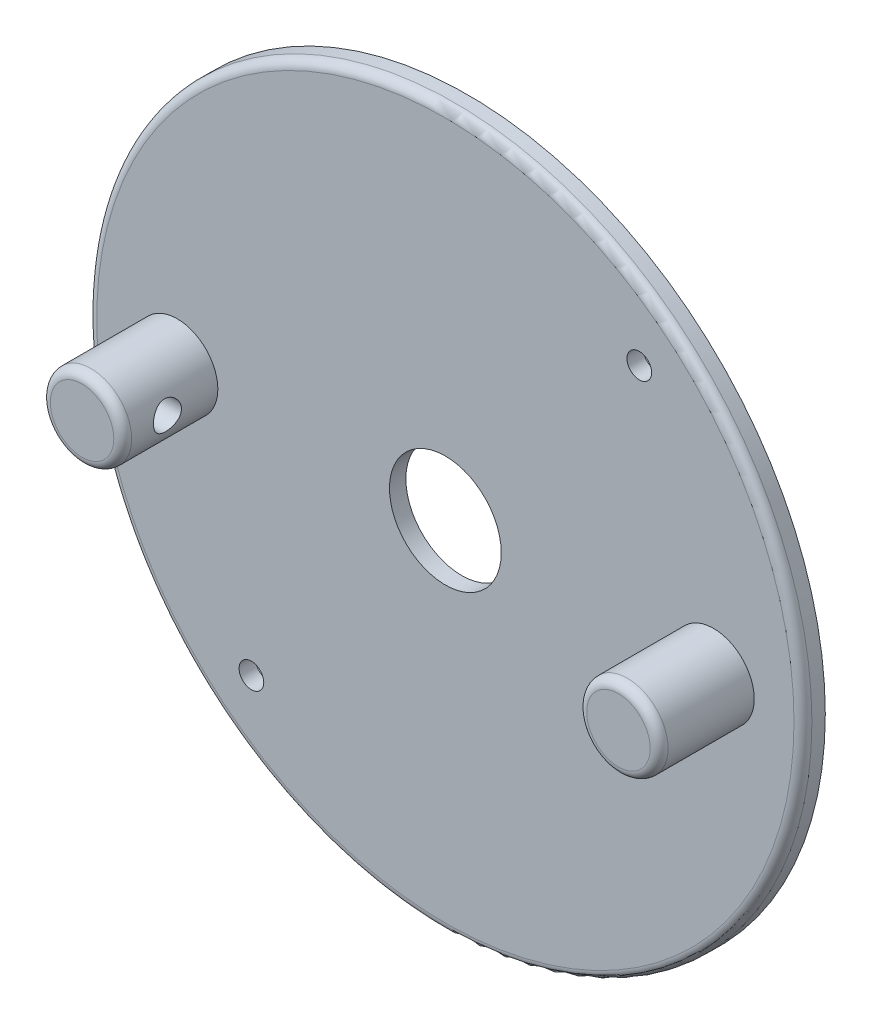
ISO-10303-21;
HEADER;
FILE_DESCRIPTION(('STEP AP214'),'2;1');
FILE_NAME('part.step','',(''),(''),'','','');
FILE_SCHEMA(('AUTOMOTIVE_DESIGN { 1 0 10303 214 1 1 1 1 }'));
ENDSEC;
DATA;
#1=APPLICATION_CONTEXT('core data for automotive mechanical design processes');
#2=APPLICATION_PROTOCOL_DEFINITION('international standard','automotive_design',2000,#1);
#3=PRODUCT_CONTEXT('',#1,'mechanical');
#4=PRODUCT('Part','Part','',(#3));
#5=PRODUCT_RELATED_PRODUCT_CATEGORY('part','',(#4));
#6=PRODUCT_DEFINITION_FORMATION('','',#4);
#7=PRODUCT_DEFINITION_CONTEXT('part definition',#1,'design');
#8=PRODUCT_DEFINITION('design','',#6,#7);
#9=PRODUCT_DEFINITION_SHAPE('','',#8);
#10=(LENGTH_UNIT() NAMED_UNIT(*) SI_UNIT(.MILLI.,.METRE.));
#11=(NAMED_UNIT(*) PLANE_ANGLE_UNIT() SI_UNIT($,.RADIAN.));
#12=(NAMED_UNIT(*) SI_UNIT($,.STERADIAN.) SOLID_ANGLE_UNIT());
#13=UNCERTAINTY_MEASURE_WITH_UNIT(LENGTH_MEASURE(1.E-05),#10,'distance_accuracy_value','');
#14=(GEOMETRIC_REPRESENTATION_CONTEXT(3) GLOBAL_UNCERTAINTY_ASSIGNED_CONTEXT((#13)) GLOBAL_UNIT_ASSIGNED_CONTEXT((#10,
#11,#12)) REPRESENTATION_CONTEXT('',''));
#15=CARTESIAN_POINT('',(0.,0.,0.));
#16=DIRECTION('',(0.,0.,1.));
#17=DIRECTION('',(1.,0.,0.));
#18=AXIS2_PLACEMENT_3D('',#15,#16,#17);
#19=CARTESIAN_POINT('',(0.,0.,3.175));
#20=DIRECTION('',(0.,0.,-1.));
#21=DIRECTION('',(-1.,0.,0.));
#22=AXIS2_PLACEMENT_3D('',#19,#20,#21);
#23=CYLINDRICAL_SURFACE('',#22,50.8);
#24=CARTESIAN_POINT('',(0.,0.,1.905));
#25=DIRECTION('',(0.,0.,1.));
#26=DIRECTION('',(1.,0.,0.));
#27=AXIS2_PLACEMENT_3D('',#24,#25,#26);
#28=CIRCLE('',#27,50.8);
#29=CARTESIAN_POINT('',(50.8,0.,1.905));
#30=VERTEX_POINT('',#29);
#31=EDGE_CURVE('E11',#30,#30,#28,.F.);
#32=ORIENTED_EDGE('',*,*,#31,.T.);
#33=EDGE_LOOP('',(#32));
#34=FACE_BOUND('',#33,.T.);
#35=CARTESIAN_POINT('',(0.,0.,0.));
#36=DIRECTION('',(0.,0.,1.));
#37=DIRECTION('',(1.,0.,0.));
#38=AXIS2_PLACEMENT_3D('',#35,#36,#37);
#39=CIRCLE('',#38,50.8);
#40=CARTESIAN_POINT('',(50.8,0.,0.));
#41=VERTEX_POINT('',#40);
#42=EDGE_CURVE('E96',#41,#41,#39,.T.);
#43=ORIENTED_EDGE('',*,*,#42,.T.);
#44=EDGE_LOOP('',(#43));
#45=FACE_BOUND('',#44,.T.);
#46=ADVANCED_FACE('F36',(#34,#45),#23,.T.);
#47=CARTESIAN_POINT('',(0.,0.,3.175));
#48=DIRECTION('',(0.,0.,1.));
#49=DIRECTION('',(1.,0.,0.));
#50=AXIS2_PLACEMENT_3D('',#47,#48,#49);
#51=PLANE('',#50);
#52=CARTESIAN_POINT('',(0.,0.,3.175));
#53=DIRECTION('',(0.,0.,1.));
#54=DIRECTION('',(1.,0.,0.));
#55=AXIS2_PLACEMENT_3D('',#52,#53,#54);
#56=CIRCLE('',#55,49.53);
#57=CARTESIAN_POINT('',(49.53,0.,3.175));
#58=VERTEX_POINT('',#57);
#59=EDGE_CURVE('E45',#58,#58,#56,.T.);
#60=ORIENTED_EDGE('',*,*,#59,.T.);
#61=EDGE_LOOP('',(#60));
#62=FACE_BOUND('',#61,.T.);
#63=CARTESIAN_POINT('',(38.1,0.,3.175));
#64=DIRECTION('',(0.,0.,1.));
#65=DIRECTION('',(1.,0.,0.));
#66=AXIS2_PLACEMENT_3D('',#63,#64,#65);
#67=CIRCLE('',#66,5.7785);
#68=CARTESIAN_POINT('',(43.8785,0.,3.175));
#69=VERTEX_POINT('',#68);
#70=EDGE_CURVE('E67',#69,#69,#67,.T.);
#71=ORIENTED_EDGE('',*,*,#70,.F.);
#72=EDGE_LOOP('',(#71));
#73=FACE_BOUND('',#72,.T.);
#74=CARTESIAN_POINT('',(-38.1,0.,3.175));
#75=DIRECTION('',(0.,0.,1.));
#76=DIRECTION('',(1.,0.,0.));
#77=AXIS2_PLACEMENT_3D('',#74,#75,#76);
#78=CIRCLE('',#77,5.7785);
#79=CARTESIAN_POINT('',(-32.3215,0.,3.175));
#80=VERTEX_POINT('',#79);
#81=EDGE_CURVE('E73',#80,#80,#78,.T.);
#82=ORIENTED_EDGE('',*,*,#81,.F.);
#83=EDGE_LOOP('',(#82));
#84=FACE_BOUND('',#83,.T.);
#85=CARTESIAN_POINT('',(27.5514839201892,32.8345799431872,3.175));
#86=DIRECTION('',(0.,0.,1.));
#87=DIRECTION('',(1.,0.,0.));
#88=AXIS2_PLACEMENT_3D('',#85,#86,#87);
#89=CIRCLE('',#88,1.7526);
#90=CARTESIAN_POINT('',(29.3040839201892,32.8345799431872,3.175));
#91=VERTEX_POINT('',#90);
#92=EDGE_CURVE('E78',#91,#91,#89,.T.);
#93=ORIENTED_EDGE('',*,*,#92,.F.);
#94=EDGE_LOOP('',(#93));
#95=FACE_BOUND('',#94,.T.);
#96=CARTESIAN_POINT('',(-27.5514839201892,-32.8345799431873,3.175));
#97=DIRECTION('',(0.,0.,1.));
#98=DIRECTION('',(1.,0.,0.));
#99=AXIS2_PLACEMENT_3D('',#96,#97,#98);
#100=CIRCLE('',#99,1.7526);
#101=CARTESIAN_POINT('',(-25.7988839201892,-32.8345799431873,3.175));
#102=VERTEX_POINT('',#101);
#103=EDGE_CURVE('E77',#102,#102,#100,.T.);
#104=ORIENTED_EDGE('',*,*,#103,.F.);
#105=EDGE_LOOP('',(#104));
#106=FACE_BOUND('',#105,.T.);
#107=CARTESIAN_POINT('',(0.,0.,3.175));
#108=DIRECTION('',(0.,0.,1.));
#109=DIRECTION('',(1.,0.,0.));
#110=AXIS2_PLACEMENT_3D('',#107,#108,#109);
#111=CIRCLE('',#110,7.9375);
#112=CARTESIAN_POINT('',(7.9375,0.,3.175));
#113=VERTEX_POINT('',#112);
#114=EDGE_CURVE('E86',#113,#113,#111,.T.);
#115=ORIENTED_EDGE('',*,*,#114,.F.);
#116=EDGE_LOOP('',(#115));
#117=FACE_BOUND('',#116,.T.);
#118=ADVANCED_FACE('F158',(#62,#73,#84,#95,#106,#117),#51,.T.);
#119=CARTESIAN_POINT('',(0.,0.,0.));
#120=DIRECTION('',(0.,0.,1.));
#121=DIRECTION('',(1.,0.,0.));
#122=AXIS2_PLACEMENT_3D('',#119,#120,#121);
#123=PLANE('',#122);
#124=CARTESIAN_POINT('',(0.,0.,0.));
#125=DIRECTION('',(0.,0.,-1.));
#126=DIRECTION('',(-1.,0.,0.));
#127=AXIS2_PLACEMENT_3D('',#124,#125,#126);
#128=CIRCLE('',#127,48.26);
#129=CARTESIAN_POINT('',(-48.26,0.,0.));
#130=VERTEX_POINT('',#129);
#131=EDGE_CURVE('E97',#130,#130,#128,.T.);
#132=ORIENTED_EDGE('',*,*,#131,.F.);
#133=EDGE_LOOP('',(#132));
#134=FACE_BOUND('',#133,.T.);
#135=ORIENTED_EDGE('',*,*,#42,.F.);
#136=EDGE_LOOP('',(#135));
#137=FACE_BOUND('',#136,.T.);
#138=ADVANCED_FACE('F164',(#134,#137),#123,.F.);
#139=CARTESIAN_POINT('',(0.,0.,0.84582));
#140=DIRECTION('',(0.,0.,-1.));
#141=DIRECTION('',(-1.,0.,0.));
#142=AXIS2_PLACEMENT_3D('',#139,#140,#141);
#143=CYLINDRICAL_SURFACE('',#142,48.26);
#144=CARTESIAN_POINT('',(0.,0.,0.84582));
#145=DIRECTION('',(0.,0.,-1.));
#146=DIRECTION('',(-1.,0.,0.));
#147=AXIS2_PLACEMENT_3D('',#144,#145,#146);
#148=CIRCLE('',#147,48.26);
#149=CARTESIAN_POINT('',(-48.26,0.,0.84582));
#150=VERTEX_POINT('',#149);
#151=EDGE_CURVE('E92',#150,#150,#148,.T.);
#152=ORIENTED_EDGE('',*,*,#151,.F.);
#153=EDGE_LOOP('',(#152));
#154=FACE_BOUND('',#153,.T.);
#155=ORIENTED_EDGE('',*,*,#131,.T.);
#156=EDGE_LOOP('',(#155));
#157=FACE_BOUND('',#156,.T.);
#158=ADVANCED_FACE('F223',(#154,#157),#143,.F.);
#159=CARTESIAN_POINT('',(0.,0.,0.84582));
#160=DIRECTION('',(0.,0.,-1.));
#161=DIRECTION('',(-1.,0.,0.));
#162=AXIS2_PLACEMENT_3D('',#159,#160,#161);
#163=PLANE('',#162);
#164=CARTESIAN_POINT('',(27.5514839201892,32.8345799431872,0.84582));
#165=DIRECTION('',(0.,0.,-1.));
#166=DIRECTION('',(-1.,0.,0.));
#167=AXIS2_PLACEMENT_3D('',#164,#165,#166);
#168=CIRCLE('',#167,1.7526);
#169=CARTESIAN_POINT('',(25.7988839201892,32.8345799431872,0.84582));
#170=VERTEX_POINT('',#169);
#171=EDGE_CURVE('E91',#170,#170,#168,.T.);
#172=ORIENTED_EDGE('',*,*,#171,.F.);
#173=EDGE_LOOP('',(#172));
#174=FACE_BOUND('',#173,.T.);
#175=CARTESIAN_POINT('',(-27.5514839201892,-32.8345799431873,0.84582));
#176=DIRECTION('',(0.,0.,-1.));
#177=DIRECTION('',(-1.,0.,0.));
#178=AXIS2_PLACEMENT_3D('',#175,#176,#177);
#179=CIRCLE('',#178,1.7526);
#180=CARTESIAN_POINT('',(-29.3040839201892,-32.8345799431873,0.84582));
#181=VERTEX_POINT('',#180);
#182=EDGE_CURVE('E82',#181,#181,#179,.T.);
#183=ORIENTED_EDGE('',*,*,#182,.F.);
#184=EDGE_LOOP('',(#183));
#185=FACE_BOUND('',#184,.T.);
#186=CARTESIAN_POINT('',(0.,0.,0.845820000000001));
#187=DIRECTION('',(0.,0.,-1.));
#188=DIRECTION('',(-1.,0.,0.));
#189=AXIS2_PLACEMENT_3D('',#186,#187,#188);
#190=CIRCLE('',#189,7.9375);
#191=CARTESIAN_POINT('',(-7.9375,0.,0.845820000000001));
#192=VERTEX_POINT('',#191);
#193=EDGE_CURVE('E90',#192,#192,#190,.T.);
#194=ORIENTED_EDGE('',*,*,#193,.F.);
#195=EDGE_LOOP('',(#194));
#196=FACE_BOUND('',#195,.T.);
#197=ORIENTED_EDGE('',*,*,#151,.T.);
#198=EDGE_LOOP('',(#197));
#199=FACE_BOUND('',#198,.T.);
#200=ADVANCED_FACE('F214',(#174,#185,#196,#199),#163,.T.);
#201=CARTESIAN_POINT('',(0.,0.,-17.9578));
#202=DIRECTION('',(0.,0.,1.));
#203=DIRECTION('',(1.,0.,0.));
#204=AXIS2_PLACEMENT_3D('',#201,#202,#203);
#205=CYLINDRICAL_SURFACE('',#204,7.9375);
#206=ORIENTED_EDGE('',*,*,#193,.T.);
#207=EDGE_LOOP('',(#206));
#208=FACE_BOUND('',#207,.T.);
#209=ORIENTED_EDGE('',*,*,#114,.T.);
#210=EDGE_LOOP('',(#209));
#211=FACE_BOUND('',#210,.T.);
#212=ADVANCED_FACE('F211',(#208,#211),#205,.F.);
#213=CARTESIAN_POINT('',(-27.5514839201892,-32.8345799431873,0.));
#214=DIRECTION('',(0.,0.,1.));
#215=DIRECTION('',(1.,0.,0.));
#216=AXIS2_PLACEMENT_3D('',#213,#214,#215);
#217=CYLINDRICAL_SURFACE('',#216,1.7526);
#218=ORIENTED_EDGE('',*,*,#182,.T.);
#219=EDGE_LOOP('',(#218));
#220=FACE_BOUND('',#219,.T.);
#221=ORIENTED_EDGE('',*,*,#103,.T.);
#222=EDGE_LOOP('',(#221));
#223=FACE_BOUND('',#222,.T.);
#224=ADVANCED_FACE('F213',(#220,#223),#217,.F.);
#225=CARTESIAN_POINT('',(27.5514839201892,32.8345799431872,0.));
#226=DIRECTION('',(0.,0.,1.));
#227=DIRECTION('',(1.,0.,0.));
#228=AXIS2_PLACEMENT_3D('',#225,#226,#227);
#229=CYLINDRICAL_SURFACE('',#228,1.7526);
#230=ORIENTED_EDGE('',*,*,#171,.T.);
#231=EDGE_LOOP('',(#230));
#232=FACE_BOUND('',#231,.T.);
#233=ORIENTED_EDGE('',*,*,#92,.T.);
#234=EDGE_LOOP('',(#233));
#235=FACE_BOUND('',#234,.T.);
#236=ADVANCED_FACE('F154',(#232,#235),#229,.F.);
#237=CARTESIAN_POINT('',(-38.1,0.,16.6878));
#238=DIRECTION('',(0.,0.,-1.));
#239=DIRECTION('',(-1.,0.,0.));
#240=AXIS2_PLACEMENT_3D('',#237,#238,#239);
#241=CYLINDRICAL_SURFACE('',#240,5.7785);
#242=CARTESIAN_POINT('',(-38.1,0.,15.4178));
#243=DIRECTION('',(0.,0.,1.));
#244=DIRECTION('',(1.,0.,0.));
#245=AXIS2_PLACEMENT_3D('',#242,#243,#244);
#246=CIRCLE('',#245,5.7785);
#247=CARTESIAN_POINT('',(-32.3215,0.,15.4178));
#248=VERTEX_POINT('',#247);
#249=EDGE_CURVE('E182',#248,#248,#246,.F.);
#250=ORIENTED_EDGE('',*,*,#249,.T.);
#251=EDGE_LOOP('',(#250));
#252=FACE_BOUND('',#251,.T.);
#253=CARTESIAN_POINT('',(-32.7469233681033,2.17615091917849,10.3295579636098));
#254=CARTESIAN_POINT('',(-32.7469244038182,2.17615210662921,10.2216840506112));
#255=CARTESIAN_POINT('',(-32.7433600864788,2.16744619654072,10.1138185890226));
#256=CARTESIAN_POINT('',(-32.7295397310188,2.13296897794421,9.90129661266825));
#257=CARTESIAN_POINT('',(-32.7192829236911,2.10719570777938,9.79664046821612));
#258=CARTESIAN_POINT('',(-32.6932929184909,2.03957762805224,9.59365298222572));
#259=CARTESIAN_POINT('',(-32.6775709978546,1.99776589553619,9.49530910661279));
#260=CARTESIAN_POINT('',(-32.6423144150311,1.89932989097696,9.30708749807465));
#261=CARTESIAN_POINT('',(-32.6227788336143,1.84270204659537,9.2172118140477));
#262=CARTESIAN_POINT('',(-32.5810182938103,1.71366926240623,9.04474287740923));
#263=CARTESIAN_POINT('',(-32.5587196593025,1.64074951534733,8.96255251735055));
#264=CARTESIAN_POINT('',(-32.5142296735561,1.48222862228021,8.81141552451749));
#265=CARTESIAN_POINT('',(-32.4920383414008,1.39662530043826,8.74247116872999));
#266=CARTESIAN_POINT('',(-32.449254764122,1.21216254702683,8.61792940322431));
#267=CARTESIAN_POINT('',(-32.4287243663925,1.11300002730416,8.56275779126923));
#268=CARTESIAN_POINT('',(-32.3919953238223,0.905967195366005,8.47015224951553));
#269=CARTESIAN_POINT('',(-32.3757954356654,0.798099394095146,8.43271322619275));
#270=CARTESIAN_POINT('',(-32.3497699121055,0.580891297832432,8.37801262580805));
#271=CARTESIAN_POINT('',(-32.339731895439,0.471750810865131,8.36006006969986));
#272=CARTESIAN_POINT('',(-32.3259290934117,0.251625013237367,8.34264102578906));
#273=CARTESIAN_POINT('',(-32.3221625943803,0.140640214902905,8.34316948724335));
#274=CARTESIAN_POINT('',(-32.3210223026354,-0.075116043300754,8.36226748079604));
#275=CARTESIAN_POINT('',(-32.3233891239719,-0.179953928332531,8.38008568644464));
#276=CARTESIAN_POINT('',(-32.333439423202,-0.385237908721068,8.43200997672716));
#277=CARTESIAN_POINT('',(-32.3411232666378,-0.485683701619081,8.46611718117086));
#278=CARTESIAN_POINT('',(-32.3609065571063,-0.680906550101159,8.55006844588344));
#279=CARTESIAN_POINT('',(-32.3730643745771,-0.775588452329316,8.60011930158231));
#280=CARTESIAN_POINT('',(-32.4003231415406,-0.955531460105961,8.71436405674724));
#281=CARTESIAN_POINT('',(-32.4154249434587,-1.04078982585557,8.7785620531964));
#282=CARTESIAN_POINT('',(-32.4476629031354,-1.20391253618106,8.92302736337027));
#283=CARTESIAN_POINT('',(-32.4648629061314,-1.28119759186322,9.00393548550368));
#284=CARTESIAN_POINT('',(-32.4985494030693,-1.42127277276157,9.17761266486548));
#285=CARTESIAN_POINT('',(-32.5150357721416,-1.48406036952183,9.27038378670478));
#286=CARTESIAN_POINT('',(-32.5454547455362,-1.59418243006221,9.46709819632805));
#287=CARTESIAN_POINT('',(-32.5593424317085,-1.6412544916336,9.57119605609472));
#288=CARTESIAN_POINT('',(-32.582286543143,-1.7168222276835,9.7864229435298));
#289=CARTESIAN_POINT('',(-32.5913451428925,-1.74532626443581,9.89754878131379));
#290=CARTESIAN_POINT('',(-32.6029995722092,-1.78168399541011,10.1180186573734));
#291=CARTESIAN_POINT('',(-32.6058821691615,-1.79045498694171,10.2271962519669));
#292=CARTESIAN_POINT('',(-32.6056348446807,-1.78969733689818,10.4454685891209));
#293=CARTESIAN_POINT('',(-32.6025061030731,-1.78017228622616,10.5545633437363));
#294=CARTESIAN_POINT('',(-32.5909072790607,-1.74393066589738,10.7653326569925));
#295=CARTESIAN_POINT('',(-32.5826404227019,-1.7178674393054,10.8671322523003));
#296=CARTESIAN_POINT('',(-32.5619995627249,-1.65010880149831,11.0649394485793));
#297=CARTESIAN_POINT('',(-32.5496248033978,-1.60841051380243,11.1609459799885));
#298=CARTESIAN_POINT('',(-32.5217736650094,-1.50903701486612,11.3479728132912));
#299=CARTESIAN_POINT('',(-32.5062080393339,-1.45087783644519,11.4387221844492));
#300=CARTESIAN_POINT('',(-32.4740822146348,-1.32082961754574,11.6095991420996));
#301=CARTESIAN_POINT('',(-32.457521706419,-1.24893629344195,11.689723401418));
#302=CARTESIAN_POINT('',(-32.4244499842203,-1.08911839364808,11.8413496668015));
#303=CARTESIAN_POINT('',(-32.4079853434608,-1.00055833787977,11.91219404103));
#304=CARTESIAN_POINT('',(-32.3781032327456,-0.812415741125375,12.0381748955506));
#305=CARTESIAN_POINT('',(-32.3646856757522,-0.712833515100821,12.0933118245263));
#306=CARTESIAN_POINT('',(-32.3427584774062,-0.505940319246854,12.1858305783452));
#307=CARTESIAN_POINT('',(-32.334219425056,-0.39868014739064,12.2233185567859));
#308=CARTESIAN_POINT('',(-32.3232310989446,-0.179074656244305,12.2796182029207));
#309=CARTESIAN_POINT('',(-32.3207794756773,-0.0667313159076797,12.2984370744649));
#310=CARTESIAN_POINT('',(-32.3225474275344,0.153832064458494,12.3161850647125));
#311=CARTESIAN_POINT('',(-32.3264416869465,0.261979739308479,12.3160556952414));
#312=CARTESIAN_POINT('',(-32.3401718175418,0.476427293319663,12.2982564342571));
#313=CARTESIAN_POINT('',(-32.3500071558742,0.582727337313912,12.280588115707));
#314=CARTESIAN_POINT('',(-32.3746398763357,0.788595462441957,12.2288475662659));
#315=CARTESIAN_POINT('',(-32.3893462432032,0.888249455671077,12.1950715591305));
#316=CARTESIAN_POINT('',(-32.4225540084652,1.08036252418362,12.112352898834));
#317=CARTESIAN_POINT('',(-32.4410561056684,1.17282027028045,12.0634074520719));
#318=CARTESIAN_POINT('',(-32.481069289294,1.35181945582808,11.9495858917428));
#319=CARTESIAN_POINT('',(-32.5026685038493,1.43799847618216,11.8841712445694));
#320=CARTESIAN_POINT('',(-32.5463504678926,1.59842559102715,11.7401679543348));
#321=CARTESIAN_POINT('',(-32.5684333742899,1.6726697467266,11.6615749795214));
#322=CARTESIAN_POINT('',(-32.6119168676511,1.81037171945293,11.4894801322577));
#323=CARTESIAN_POINT('',(-32.6332491937593,1.87324119289425,11.3954886084865));
#324=CARTESIAN_POINT('',(-32.6718713007698,1.98238450983111,11.1975533615758));
#325=CARTESIAN_POINT('',(-32.6891618237677,2.02866140064408,11.0936114703224));
#326=CARTESIAN_POINT('',(-32.7172919005009,2.10215064409317,10.8812789741633));
#327=CARTESIAN_POINT('',(-32.7282808686548,2.12980752924508,10.773062736966));
#328=CARTESIAN_POINT('',(-32.7430946156112,2.16680334329147,10.5530796599815));
#329=CARTESIAN_POINT('',(-32.7469222951128,2.17614968899122,10.4413142764496));
#330=CARTESIAN_POINT('',(-32.7469233681033,2.17615091917849,10.3295579636098));
#331=B_SPLINE_CURVE_WITH_KNOTS('',3,(#253,#254,#255,#256,#257,#258,#259,#260,#261,#262,#263,
#264,#265,#266,#267,#268,#269,#270,#271,#272,#273,#274,#275,#276,#277,#278,#279,#280,#281,#282,
#283,#284,#285,#286,#287,#288,#289,#290,#291,#292,#293,#294,#295,#296,#297,#298,#299,#300,#301,
#302,#303,#304,#305,#306,#307,#308,#309,#310,#311,#312,#313,#314,#315,#316,#317,#318,#319,#320,
#321,#322,#323,#324,#325,#326,#327,#328,#329,#330),.UNSPECIFIED.,.T.,.F.,(4,2,2,2,2,2,2,2,2,2,2,
2,2,2,2,2,2,2,2,2,2,2,2,2,2,2,2,2,2,2,2,2,2,2,2,2,2,2,4),(0.,0.32320734928644,0.646451853232788,
0.969033264789225,1.2916925262999,1.62652993402205,1.96142484886399,2.30565848151978,
2.64979317615295,2.98128049345205,3.31267721811007,3.63028960958184,3.94792383890102,
4.26985822093876,4.59188595732531,4.92994302115653,5.26805899999,5.61156698762833,
5.95492016626384,6.28195032292876,6.60891630103486,6.92370750195644,7.2385566454391,
7.56384674018581,7.88923845775132,8.23140859475281,8.57356895667228,8.91364416121894,
9.25358808981065,9.57664670149411,9.89967634260453,10.2169819249327,10.5343459769529,
10.8638699353837,11.1935024223396,11.5370636269615,11.8805617023539,12.2155370492695,
12.550376684126),.UNSPECIFIED.);
#332=CARTESIAN_POINT('',(-32.7469233681033,2.17615091917849,10.3295579636098));
#333=VERTEX_POINT('',#332);
#334=EDGE_CURVE('E104',#333,#333,#331,.T.);
#335=ORIENTED_EDGE('',*,*,#334,.T.);
#336=EDGE_LOOP('',(#335));
#337=FACE_BOUND('',#336,.T.);
#338=ORIENTED_EDGE('',*,*,#81,.T.);
#339=EDGE_LOOP('',(#338));
#340=FACE_BOUND('',#339,.T.);
#341=ADVANCED_FACE('F129',(#252,#337,#340),#241,.T.);
#342=CARTESIAN_POINT('',(-38.1,0.,16.6878));
#343=DIRECTION('',(0.,0.,1.));
#344=DIRECTION('',(1.,0.,0.));
#345=AXIS2_PLACEMENT_3D('',#342,#343,#344);
#346=PLANE('',#345);
#347=CARTESIAN_POINT('',(-38.1,0.,16.6878));
#348=DIRECTION('',(0.,0.,1.));
#349=DIRECTION('',(1.,0.,0.));
#350=AXIS2_PLACEMENT_3D('',#347,#348,#349);
#351=CIRCLE('',#350,4.5085);
#352=CARTESIAN_POINT('',(-33.5915,0.,16.6878));
#353=VERTEX_POINT('',#352);
#354=EDGE_CURVE('E184',#353,#353,#351,.T.);
#355=ORIENTED_EDGE('',*,*,#354,.T.);
#356=EDGE_LOOP('',(#355));
#357=FACE_BOUND('',#356,.T.);
#358=ADVANCED_FACE('F147',(#357),#346,.T.);
#359=CARTESIAN_POINT('',(38.1,0.,16.6878));
#360=DIRECTION('',(0.,0.,-1.));
#361=DIRECTION('',(-1.,0.,0.));
#362=AXIS2_PLACEMENT_3D('',#359,#360,#361);
#363=CYLINDRICAL_SURFACE('',#362,5.7785);
#364=CARTESIAN_POINT('',(38.1,0.,15.4178));
#365=DIRECTION('',(0.,0.,1.));
#366=DIRECTION('',(1.,0.,0.));
#367=AXIS2_PLACEMENT_3D('',#364,#365,#366);
#368=CIRCLE('',#367,5.7785);
#369=CARTESIAN_POINT('',(43.8785,0.,15.4178));
#370=VERTEX_POINT('',#369);
#371=EDGE_CURVE('E186',#370,#370,#368,.F.);
#372=ORIENTED_EDGE('',*,*,#371,.T.);
#373=EDGE_LOOP('',(#372));
#374=FACE_BOUND('',#373,.T.);
#375=CARTESIAN_POINT('',(32.3215,0.,12.3032604134634));
#376=CARTESIAN_POINT('',(32.3214998312963,-0.108976033447118,12.291919678465));
#377=CARTESIAN_POINT('',(32.3246108716342,-0.217009715581201,12.271546399676));
#378=CARTESIAN_POINT('',(32.336403151383,-0.428010929301236,12.213518096674));
#379=CARTESIAN_POINT('',(32.3450857295451,-0.530977236874243,12.1758589195562));
#380=CARTESIAN_POINT('',(32.3667838992617,-0.728828132730631,12.0846485916719));
#381=CARTESIAN_POINT('',(32.3797905782373,-0.823728844273163,12.031130153519));
#382=CARTESIAN_POINT('',(32.4085521451682,-1.00338013064217,11.9097303839011));
#383=CARTESIAN_POINT('',(32.4243075526666,-1.08812878148929,11.8418463366442));
#384=CARTESIAN_POINT('',(32.4573239310877,-1.24827694587045,11.6907833040974));
#385=CARTESIAN_POINT('',(32.4746184359291,-1.32324004151058,11.6071484570825));
#386=CARTESIAN_POINT('',(32.5080792116569,-1.45819428937845,11.4283390783135));
#387=CARTESIAN_POINT('',(32.5242453743517,-1.51818400729505,11.3331634423549));
#388=CARTESIAN_POINT('',(32.5535143078838,-1.62188285027728,11.1326350577527));
#389=CARTESIAN_POINT('',(32.5665853354569,-1.66542578922575,11.027191297812));
#390=CARTESIAN_POINT('',(32.5876053856888,-1.73374269108258,10.8099147922498));
#391=CARTESIAN_POINT('',(32.5955567976689,-1.75852541032331,10.6980850535291));
#392=CARTESIAN_POINT('',(32.6049041118912,-1.78751314640834,10.4773304021123));
#393=CARTESIAN_POINT('',(32.6066132546938,-1.79270188167646,10.3685476080208));
#394=CARTESIAN_POINT('',(32.6041101197379,-1.78501362497783,10.1517029070994));
#395=CARTESIAN_POINT('',(32.5998987035499,-1.77213926158631,10.0436408976786));
#396=CARTESIAN_POINT('',(32.5863642215692,-1.72955262294069,9.83480946553108));
#397=CARTESIAN_POINT('',(32.577205960412,-1.70038223275686,9.73391758668027));
#398=CARTESIAN_POINT('',(32.555037552317,-1.62663074362286,9.53839131307035));
#399=CARTESIAN_POINT('',(32.5420266214254,-1.58204650790409,9.44375819666351));
#400=CARTESIAN_POINT('',(32.5131195374552,-1.47679074670646,9.25942117675087));
#401=CARTESIAN_POINT('',(32.4971313188435,-1.41556413102507,9.17004907238764));
#402=CARTESIAN_POINT('',(32.4645152873005,-1.27955404644839,9.00241035353248));
#403=CARTESIAN_POINT('',(32.4478872790591,-1.20476641146522,8.92414716502556));
#404=CARTESIAN_POINT('',(32.4151134844624,-1.03949559711518,8.77705142564019));
#405=CARTESIAN_POINT('',(32.3990302117293,-0.948427052186095,8.7088604578712));
#406=CARTESIAN_POINT('',(32.3702985918548,-0.755687088017073,8.58862648978202));
#407=CARTESIAN_POINT('',(32.3576499534385,-0.654016568892613,8.53658212009262));
#408=CARTESIAN_POINT('',(32.3376469174836,-0.444189688777832,8.45091332417855));
#409=CARTESIAN_POINT('',(32.3302275737331,-0.336131639855298,8.41706422036365));
#410=CARTESIAN_POINT('',(32.3216051565118,-0.115622416163849,8.36809225458675));
#411=CARTESIAN_POINT('',(32.3203997353531,-0.00317291671421596,8.35296232195937));
#412=CARTESIAN_POINT('',(32.3245752559448,0.216893606593657,8.34231218339461));
#413=CARTESIAN_POINT('',(32.3296311066511,0.324472330015977,8.34585271288456));
#414=CARTESIAN_POINT('',(32.3455361414057,0.53719990481705,8.37024584932723));
#415=CARTESIAN_POINT('',(32.3563850006792,0.642348892069951,8.3910974857995));
#416=CARTESIAN_POINT('',(32.382858812512,0.84604549598122,8.4489900381242));
#417=CARTESIAN_POINT('',(32.3984249615222,0.944657129471367,8.48583391794053));
#418=CARTESIAN_POINT('',(32.4330887642928,1.13422931270231,8.57448670591535));
#419=CARTESIAN_POINT('',(32.4521871442579,1.22518828349843,8.62629869265651));
#420=CARTESIAN_POINT('',(32.4931598543041,1.40103504374378,8.74592090892394));
#421=CARTESIAN_POINT('',(32.5151168549102,1.48551006961922,8.81430938909615));
#422=CARTESIAN_POINT('',(32.5591237777584,1.64206527053099,8.96404875424426));
#423=CARTESIAN_POINT('',(32.5811737270341,1.7141415419187,9.0454037061354));
#424=CARTESIAN_POINT('',(32.6240741336502,1.84671258057127,9.2225418036061));
#425=CARTESIAN_POINT('',(32.644845441437,1.90665293688178,9.31876064954621));
#426=CARTESIAN_POINT('',(32.6819097581617,2.00956928731697,9.52067806936046));
#427=CARTESIAN_POINT('',(32.6982037675781,2.05254907231827,9.62637451839579));
#428=CARTESIAN_POINT('',(32.7240130421309,2.11921778526401,9.8415894030833));
#429=CARTESIAN_POINT('',(32.7336861084157,2.1433578580463,9.95094848626179));
#430=CARTESIAN_POINT('',(32.7456694002882,2.17312574337753,10.1725369010113));
#431=CARTESIAN_POINT('',(32.7479826450467,2.17876114700511,10.2847650365792));
#432=CARTESIAN_POINT('',(32.7450369507644,2.1715056154423,10.5024437777542));
#433=CARTESIAN_POINT('',(32.7401786148172,2.15959487832417,10.6079342382375));
#434=CARTESIAN_POINT('',(32.7241836814145,2.11946251045677,10.8152638011253));
#435=CARTESIAN_POINT('',(32.7130466175656,2.09123966801577,10.9171026316835));
#436=CARTESIAN_POINT('',(32.6856651600308,2.01928604807724,11.1148622331396));
#437=CARTESIAN_POINT('',(32.6694001759795,1.97549265728546,11.2107572466997));
#438=CARTESIAN_POINT('',(32.6334349018674,1.87366902504668,11.3939605496713));
#439=CARTESIAN_POINT('',(32.6137336415729,1.81563476079669,11.4812664030126));
#440=CARTESIAN_POINT('',(32.57160933215,1.68316393356705,11.6499214589269));
#441=CARTESIAN_POINT('',(32.5490961317366,1.60799990654921,11.7306775598379));
#442=CARTESIAN_POINT('',(32.5044905687198,1.44514921400368,11.8785613216421));
#443=CARTESIAN_POINT('',(32.4823982925806,1.35746000639231,11.94568620926));
#444=CARTESIAN_POINT('',(32.440243003722,1.16948157195857,12.0658375113328));
#445=CARTESIAN_POINT('',(32.4202377142955,1.06895072940411,12.1185077466679));
#446=CARTESIAN_POINT('',(32.3848140323465,0.859624736523127,12.2058934060706));
#447=CARTESIAN_POINT('',(32.3693937093046,0.750833088735341,12.2406163914632));
#448=CARTESIAN_POINT('',(32.3453918602901,0.535303955923571,12.2891872680721));
#449=CARTESIAN_POINT('',(32.3364382614267,0.4288746774628,12.3042206751022));
#450=CARTESIAN_POINT('',(32.324492867299,0.214661324764164,12.3168170913927));
#451=CARTESIAN_POINT('',(32.3215001654549,0.106877459052136,12.3143827575429));
#452=CARTESIAN_POINT('',(32.3215,0.,12.3032604134634));
#453=B_SPLINE_CURVE_WITH_KNOTS('',3,(#375,#376,#377,#378,#379,#380,#381,#382,#383,#384,#385,
#386,#387,#388,#389,#390,#391,#392,#393,#394,#395,#396,#397,#398,#399,#400,#401,#402,#403,#404,
#405,#406,#407,#408,#409,#410,#411,#412,#413,#414,#415,#416,#417,#418,#419,#420,#421,#422,#423,
#424,#425,#426,#427,#428,#429,#430,#431,#432,#433,#434,#435,#436,#437,#438,#439,#440,#441,#442,
#443,#444,#445,#446,#447,#448,#449,#450,#451,#452),.UNSPECIFIED.,.T.,.F.,(4,2,2,2,2,2,2,2,2,2,2,
2,2,2,2,2,2,2,2,2,2,2,2,2,2,2,2,2,2,2,2,2,2,2,2,2,2,2,4),(0.,0.328288486812402,0.65665588563658,
0.984350626412879,1.31210737270748,1.65145079148174,1.99082670375415,2.33354550617759,
2.67610424580301,3.00121686603084,3.32628218018074,3.64113158256456,3.95604509559621,
4.2831279579007,4.61031147427234,4.95336536319766,5.29639015027003,5.63507580263558,
5.97363348647497,6.29532682667343,6.61700213359312,6.93482192316721,7.25270712728878,
7.58388135181454,7.91515965381539,8.25922479850468,8.60321299718497,8.93868700833619,
9.27402338244394,9.59132254477494,9.90864527967268,10.2272587601611,10.5459623473227,
10.8822229985623,11.2185519937694,11.5625461486136,11.9063952574934,12.2284108022561,
12.5503773686351),.UNSPECIFIED.);
#454=CARTESIAN_POINT('',(32.3215,0.,12.3032604134634));
#455=VERTEX_POINT('',#454);
#456=EDGE_CURVE('E122',#455,#455,#453,.T.);
#457=ORIENTED_EDGE('',*,*,#456,.T.);
#458=EDGE_LOOP('',(#457));
#459=FACE_BOUND('',#458,.T.);
#460=ORIENTED_EDGE('',*,*,#70,.T.);
#461=EDGE_LOOP('',(#460));
#462=FACE_BOUND('',#461,.T.);
#463=ADVANCED_FACE('F143',(#374,#459,#462),#363,.T.);
#464=CARTESIAN_POINT('',(38.1,0.,16.6878));
#465=DIRECTION('',(0.,0.,1.));
#466=DIRECTION('',(1.,0.,0.));
#467=AXIS2_PLACEMENT_3D('',#464,#465,#466);
#468=PLANE('',#467);
#469=CARTESIAN_POINT('',(38.1,0.,16.6878));
#470=DIRECTION('',(0.,0.,1.));
#471=DIRECTION('',(1.,0.,0.));
#472=AXIS2_PLACEMENT_3D('',#469,#470,#471);
#473=CIRCLE('',#472,4.5085);
#474=CARTESIAN_POINT('',(42.6085,0.,16.6878));
#475=VERTEX_POINT('',#474);
#476=EDGE_CURVE('E193',#475,#475,#473,.T.);
#477=ORIENTED_EDGE('',*,*,#476,.T.);
#478=EDGE_LOOP('',(#477));
#479=FACE_BOUND('',#478,.T.);
#480=ADVANCED_FACE('F138',(#479),#468,.T.);
#481=CARTESIAN_POINT('',(-32.3251563250653,0.205530484519038,10.3295579636098));
#482=DIRECTION('',(0.99936725360123,0.035568137841834,0.));
#483=DIRECTION('',(-0.035568137841834,0.99936725360123,0.));
#484=AXIS2_PLACEMENT_3D('',#481,#482,#483);
#485=CYLINDRICAL_SURFACE('',#484,1.98437499999999);
#486=CARTESIAN_POINT('',(-39.8895669410237,-0.0636918644333717,10.3295579636098));
#487=DIRECTION('',(0.99936725360123,0.035568137841834,0.));
#488=DIRECTION('',(-0.035568137841834,0.99936725360123,0.));
#489=AXIS2_PLACEMENT_3D('',#486,#487,#488);
#490=CIRCLE('',#489,1.984375);
#491=CARTESIAN_POINT('',(-39.9601474645536,1.91942752943157,10.3295579636098));
#492=VERTEX_POINT('',#491);
#493=EDGE_CURVE('E62',#492,#492,#490,.T.);
#494=ORIENTED_EDGE('',*,*,#493,.F.);
#495=EDGE_LOOP('',(#494));
#496=FACE_BOUND('',#495,.T.);
#497=ORIENTED_EDGE('',*,*,#334,.F.);
#498=EDGE_LOOP('',(#497));
#499=FACE_BOUND('',#498,.T.);
#500=ADVANCED_FACE('F133',(#496,#499),#485,.F.);
#501=CARTESIAN_POINT('',(-39.8895669410237,-0.0636918644333717,10.3295579636098));
#502=DIRECTION('',(0.99936725360123,0.035568137841834,0.));
#503=DIRECTION('',(-0.035568137841834,0.99936725360123,0.));
#504=AXIS2_PLACEMENT_3D('',#501,#502,#503);
#505=CONICAL_SURFACE('',#504,1.984375,1.02974425867665);
#506=CARTESIAN_POINT('',(-41.081145287627,-0.10610092149283,10.3295579636098));
#507=VERTEX_POINT('',#506);
#508=VERTEX_LOOP('',#507);
#509=FACE_BOUND('',#508,.T.);
#510=ORIENTED_EDGE('',*,*,#493,.T.);
#511=EDGE_LOOP('',(#510));
#512=FACE_BOUND('',#511,.T.);
#513=ADVANCED_FACE('F137',(#509,#512),#505,.F.);
#514=CARTESIAN_POINT('',(32.3251563250653,0.205530484519038,10.3295579636098));
#515=DIRECTION('',(-0.99936725360123,0.035568137841834,0.));
#516=DIRECTION('',(-0.035568137841834,-0.99936725360123,0.));
#517=AXIS2_PLACEMENT_3D('',#514,#515,#516);
#518=CYLINDRICAL_SURFACE('',#517,1.98437499999999);
#519=CARTESIAN_POINT('',(39.8895669410237,-0.0636918644333717,10.3295579636098));
#520=DIRECTION('',(-0.99936725360123,0.035568137841834,0.));
#521=DIRECTION('',(-0.035568137841834,-0.99936725360123,0.));
#522=AXIS2_PLACEMENT_3D('',#519,#520,#521);
#523=CIRCLE('',#522,1.984375);
#524=CARTESIAN_POINT('',(39.8189864174938,-2.04681125829831,10.3295579636098));
#525=VERTEX_POINT('',#524);
#526=EDGE_CURVE('E59',#525,#525,#523,.T.);
#527=ORIENTED_EDGE('',*,*,#526,.F.);
#528=EDGE_LOOP('',(#527));
#529=FACE_BOUND('',#528,.T.);
#530=ORIENTED_EDGE('',*,*,#456,.F.);
#531=EDGE_LOOP('',(#530));
#532=FACE_BOUND('',#531,.T.);
#533=ADVANCED_FACE('F55',(#529,#532),#518,.F.);
#534=CARTESIAN_POINT('',(39.8895669410237,-0.0636918644333717,10.3295579636098));
#535=DIRECTION('',(-0.99936725360123,0.035568137841834,0.));
#536=DIRECTION('',(-0.035568137841834,-0.99936725360123,0.));
#537=AXIS2_PLACEMENT_3D('',#534,#535,#536);
#538=CONICAL_SURFACE('',#537,1.984375,1.02974425867665);
#539=CARTESIAN_POINT('',(41.081145287627,-0.10610092149283,10.3295579636098));
#540=VERTEX_POINT('',#539);
#541=VERTEX_LOOP('',#540);
#542=FACE_BOUND('',#541,.T.);
#543=ORIENTED_EDGE('',*,*,#526,.T.);
#544=EDGE_LOOP('',(#543));
#545=FACE_BOUND('',#544,.T.);
#546=ADVANCED_FACE('F51',(#542,#545),#538,.F.);
#547=CARTESIAN_POINT('',(38.1,0.,15.4178));
#548=DIRECTION('',(0.,0.,1.));
#549=DIRECTION('',(1.,0.,0.));
#550=AXIS2_PLACEMENT_3D('',#547,#548,#549);
#551=TOROIDAL_SURFACE('',#550,4.5085,1.27);
#552=ORIENTED_EDGE('',*,*,#371,.F.);
#553=EDGE_LOOP('',(#552));
#554=FACE_BOUND('',#553,.T.);
#555=ORIENTED_EDGE('',*,*,#476,.F.);
#556=EDGE_LOOP('',(#555));
#557=FACE_BOUND('',#556,.T.);
#558=ADVANCED_FACE('F54',(#554,#557),#551,.T.);
#559=CARTESIAN_POINT('',(-38.1,0.,15.4178));
#560=DIRECTION('',(0.,0.,1.));
#561=DIRECTION('',(1.,0.,0.));
#562=AXIS2_PLACEMENT_3D('',#559,#560,#561);
#563=TOROIDAL_SURFACE('',#562,4.5085,1.27);
#564=ORIENTED_EDGE('',*,*,#249,.F.);
#565=EDGE_LOOP('',(#564));
#566=FACE_BOUND('',#565,.T.);
#567=ORIENTED_EDGE('',*,*,#354,.F.);
#568=EDGE_LOOP('',(#567));
#569=FACE_BOUND('',#568,.T.);
#570=ADVANCED_FACE('F171',(#566,#569),#563,.T.);
#571=CARTESIAN_POINT('',(0.,0.,1.905));
#572=DIRECTION('',(0.,0.,1.));
#573=DIRECTION('',(1.,0.,0.));
#574=AXIS2_PLACEMENT_3D('',#571,#572,#573);
#575=TOROIDAL_SURFACE('',#574,49.53,1.27);
#576=ORIENTED_EDGE('',*,*,#31,.F.);
#577=EDGE_LOOP('',(#576));
#578=FACE_BOUND('',#577,.T.);
#579=ORIENTED_EDGE('',*,*,#59,.F.);
#580=EDGE_LOOP('',(#579));
#581=FACE_BOUND('',#580,.T.);
#582=ADVANCED_FACE('F38',(#578,#581),#575,.T.);
#583=CLOSED_SHELL('',(#46,#118,#138,#158,#200,#212,#224,#236,#341,#358,#463,#480,#500,#513,#533,
#546,#558,#570,#582));
#584=MANIFOLD_SOLID_BREP('B2',#583);
#585=ADVANCED_BREP_SHAPE_REPRESENTATION('',(#18,#584),#14);
#586=SHAPE_DEFINITION_REPRESENTATION(#9,#585);
ENDSEC;
END-ISO-10303-21;
